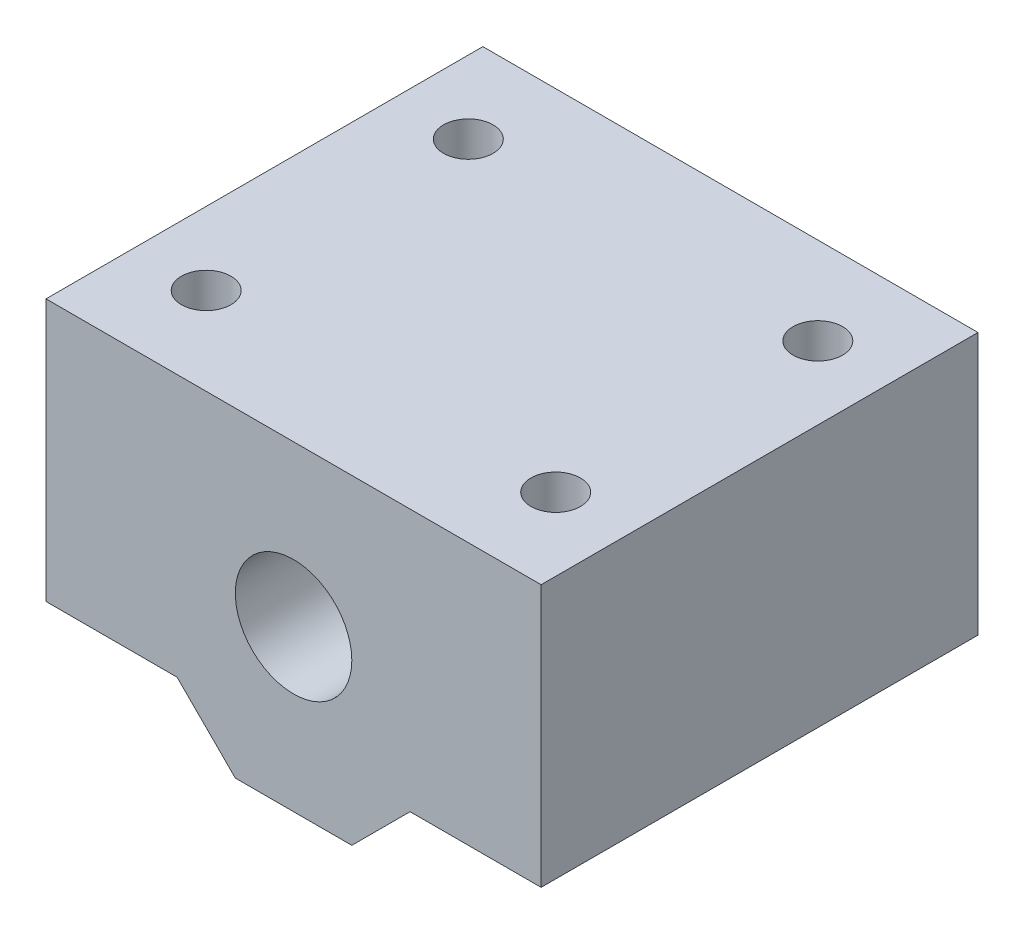
ISO-10303-21;
HEADER;
FILE_DESCRIPTION(('STEP AP214'),'2;1');
FILE_NAME('part.step','',(''),(''),'','','');
FILE_SCHEMA(('AUTOMOTIVE_DESIGN { 1 0 10303 214 1 1 1 1 }'));
ENDSEC;
DATA;
#1=APPLICATION_CONTEXT('core data for automotive mechanical design processes');
#2=APPLICATION_PROTOCOL_DEFINITION('international standard','automotive_design',2000,#1);
#3=PRODUCT_CONTEXT('',#1,'mechanical');
#4=PRODUCT('Part','Part','',(#3));
#5=PRODUCT_RELATED_PRODUCT_CATEGORY('part','',(#4));
#6=PRODUCT_DEFINITION_FORMATION('','',#4);
#7=PRODUCT_DEFINITION_CONTEXT('part definition',#1,'design');
#8=PRODUCT_DEFINITION('design','',#6,#7);
#9=PRODUCT_DEFINITION_SHAPE('','',#8);
#10=(LENGTH_UNIT() NAMED_UNIT(*) SI_UNIT(.MILLI.,.METRE.));
#11=(NAMED_UNIT(*) PLANE_ANGLE_UNIT() SI_UNIT($,.RADIAN.));
#12=(NAMED_UNIT(*) SI_UNIT($,.STERADIAN.) SOLID_ANGLE_UNIT());
#13=UNCERTAINTY_MEASURE_WITH_UNIT(LENGTH_MEASURE(1.E-05),#10,'distance_accuracy_value','');
#14=(GEOMETRIC_REPRESENTATION_CONTEXT(3) GLOBAL_UNCERTAINTY_ASSIGNED_CONTEXT((#13)) GLOBAL_UNIT_ASSIGNED_CONTEXT((#10,
#11,#12)) REPRESENTATION_CONTEXT('',''));
#15=CARTESIAN_POINT('',(0.,0.,0.));
#16=DIRECTION('',(0.,0.,1.));
#17=DIRECTION('',(1.,0.,0.));
#18=AXIS2_PLACEMENT_3D('',#15,#16,#17);
#19=CARTESIAN_POINT('',(0.,0.,30.));
#20=DIRECTION('',(0.,0.,-1.));
#21=DIRECTION('',(-1.,0.,0.));
#22=AXIS2_PLACEMENT_3D('',#19,#20,#21);
#23=PLANE('',#22);
#24=DIRECTION('',(0.,1.,0.));
#25=VECTOR('',#24,1.);
#26=CARTESIAN_POINT('',(17.,-7.,30.));
#27=LINE('',#26,#25);
#28=CARTESIAN_POINT('',(17.,-7.,30.));
#29=VERTEX_POINT('',#28);
#30=CARTESIAN_POINT('',(17.,11.,30.));
#31=VERTEX_POINT('',#30);
#32=EDGE_CURVE('E146',#29,#31,#27,.T.);
#33=ORIENTED_EDGE('',*,*,#32,.T.);
#34=DIRECTION('',(-1.,0.,0.));
#35=VECTOR('',#34,1.);
#36=CARTESIAN_POINT('',(-17.,11.,30.));
#37=LINE('',#36,#35);
#38=CARTESIAN_POINT('',(-17.,11.,30.));
#39=VERTEX_POINT('',#38);
#40=EDGE_CURVE('E94',#31,#39,#37,.T.);
#41=ORIENTED_EDGE('',*,*,#40,.T.);
#42=DIRECTION('',(0.,-1.,0.));
#43=VECTOR('',#42,1.);
#44=CARTESIAN_POINT('',(-17.,-7.,30.));
#45=LINE('',#44,#43);
#46=CARTESIAN_POINT('',(-17.,-7.,30.));
#47=VERTEX_POINT('',#46);
#48=EDGE_CURVE('E161',#39,#47,#45,.T.);
#49=ORIENTED_EDGE('',*,*,#48,.T.);
#50=DIRECTION('',(1.,0.,0.));
#51=VECTOR('',#50,1.);
#52=CARTESIAN_POINT('',(-17.,-7.,30.));
#53=LINE('',#52,#51);
#54=CARTESIAN_POINT('',(-8.,-7.,30.));
#55=VERTEX_POINT('',#54);
#56=EDGE_CURVE('E174',#47,#55,#53,.T.);
#57=ORIENTED_EDGE('',*,*,#56,.T.);
#58=DIRECTION('',(0.707106781186548,-0.707106781186548,0.));
#59=VECTOR('',#58,1.);
#60=CARTESIAN_POINT('',(-8.,-7.,30.));
#61=LINE('',#60,#59);
#62=CARTESIAN_POINT('',(-4.,-11.,30.));
#63=VERTEX_POINT('',#62);
#64=EDGE_CURVE('E113',#55,#63,#61,.T.);
#65=ORIENTED_EDGE('',*,*,#64,.T.);
#66=DIRECTION('',(1.,0.,0.));
#67=VECTOR('',#66,1.);
#68=CARTESIAN_POINT('',(-4.,-11.,30.));
#69=LINE('',#68,#67);
#70=CARTESIAN_POINT('',(3.99999999999999,-11.,30.));
#71=VERTEX_POINT('',#70);
#72=EDGE_CURVE('E107',#63,#71,#69,.T.);
#73=ORIENTED_EDGE('',*,*,#72,.T.);
#74=DIRECTION('',(0.707106781186548,0.707106781186548,0.));
#75=VECTOR('',#74,1.);
#76=CARTESIAN_POINT('',(7.99999999999999,-7.,30.));
#77=LINE('',#76,#75);
#78=CARTESIAN_POINT('',(7.99999999999999,-7.,30.));
#79=VERTEX_POINT('',#78);
#80=EDGE_CURVE('E111',#71,#79,#77,.T.);
#81=ORIENTED_EDGE('',*,*,#80,.T.);
#82=DIRECTION('',(1.,0.,0.));
#83=VECTOR('',#82,1.);
#84=CARTESIAN_POINT('',(17.,-7.,30.));
#85=LINE('',#84,#83);
#86=EDGE_CURVE('E51',#79,#29,#85,.T.);
#87=ORIENTED_EDGE('',*,*,#86,.T.);
#88=EDGE_LOOP('',(#33,#41,#49,#57,#65,#73,#81,#87));
#89=FACE_BOUND('',#88,.T.);
#90=CARTESIAN_POINT('',(0.,0.,30.));
#91=DIRECTION('',(0.,0.,1.));
#92=DIRECTION('',(1.,0.,0.));
#93=AXIS2_PLACEMENT_3D('',#90,#91,#92);
#94=CIRCLE('',#93,4.);
#95=CARTESIAN_POINT('',(3.99999999999999,0.,30.));
#96=VERTEX_POINT('',#95);
#97=EDGE_CURVE('E135',#96,#96,#94,.T.);
#98=ORIENTED_EDGE('',*,*,#97,.F.);
#99=EDGE_LOOP('',(#98));
#100=FACE_BOUND('',#99,.T.);
#101=ADVANCED_FACE('F34',(#89,#100),#23,.F.);
#102=CARTESIAN_POINT('',(0.,0.,0.));
#103=DIRECTION('',(0.,0.,-1.));
#104=DIRECTION('',(-1.,0.,0.));
#105=AXIS2_PLACEMENT_3D('',#102,#103,#104);
#106=PLANE('',#105);
#107=DIRECTION('',(0.,1.,0.));
#108=VECTOR('',#107,1.);
#109=CARTESIAN_POINT('',(17.,-7.,0.));
#110=LINE('',#109,#108);
#111=CARTESIAN_POINT('',(17.,-7.,0.));
#112=VERTEX_POINT('',#111);
#113=CARTESIAN_POINT('',(17.,11.,0.));
#114=VERTEX_POINT('',#113);
#115=EDGE_CURVE('E131',#112,#114,#110,.T.);
#116=ORIENTED_EDGE('',*,*,#115,.F.);
#117=DIRECTION('',(1.,0.,0.));
#118=VECTOR('',#117,1.);
#119=CARTESIAN_POINT('',(17.,-7.,0.));
#120=LINE('',#119,#118);
#121=CARTESIAN_POINT('',(7.99999999999999,-7.,0.));
#122=VERTEX_POINT('',#121);
#123=EDGE_CURVE('E86',#122,#112,#120,.T.);
#124=ORIENTED_EDGE('',*,*,#123,.F.);
#125=DIRECTION('',(0.707106781186548,0.707106781186548,0.));
#126=VECTOR('',#125,1.);
#127=CARTESIAN_POINT('',(7.99999999999999,-7.,0.));
#128=LINE('',#127,#126);
#129=CARTESIAN_POINT('',(3.99999999999999,-11.,0.));
#130=VERTEX_POINT('',#129);
#131=EDGE_CURVE('E80',#130,#122,#128,.T.);
#132=ORIENTED_EDGE('',*,*,#131,.F.);
#133=DIRECTION('',(1.,0.,0.));
#134=VECTOR('',#133,1.);
#135=CARTESIAN_POINT('',(-4.,-11.,0.));
#136=LINE('',#135,#134);
#137=CARTESIAN_POINT('',(-4.,-11.,0.));
#138=VERTEX_POINT('',#137);
#139=EDGE_CURVE('E121',#138,#130,#136,.T.);
#140=ORIENTED_EDGE('',*,*,#139,.F.);
#141=DIRECTION('',(0.707106781186548,-0.707106781186548,0.));
#142=VECTOR('',#141,1.);
#143=CARTESIAN_POINT('',(-8.,-7.,0.));
#144=LINE('',#143,#142);
#145=CARTESIAN_POINT('',(-8.,-7.,0.));
#146=VERTEX_POINT('',#145);
#147=EDGE_CURVE('E141',#146,#138,#144,.T.);
#148=ORIENTED_EDGE('',*,*,#147,.F.);
#149=DIRECTION('',(1.,0.,0.));
#150=VECTOR('',#149,1.);
#151=CARTESIAN_POINT('',(-17.,-7.,0.));
#152=LINE('',#151,#150);
#153=CARTESIAN_POINT('',(-17.,-7.,0.));
#154=VERTEX_POINT('',#153);
#155=EDGE_CURVE('E139',#154,#146,#152,.T.);
#156=ORIENTED_EDGE('',*,*,#155,.F.);
#157=DIRECTION('',(0.,-1.,0.));
#158=VECTOR('',#157,1.);
#159=CARTESIAN_POINT('',(-17.,-7.,0.));
#160=LINE('',#159,#158);
#161=CARTESIAN_POINT('',(-17.,11.,0.));
#162=VERTEX_POINT('',#161);
#163=EDGE_CURVE('E137',#162,#154,#160,.T.);
#164=ORIENTED_EDGE('',*,*,#163,.F.);
#165=DIRECTION('',(-1.,0.,0.));
#166=VECTOR('',#165,1.);
#167=CARTESIAN_POINT('',(-17.,11.,0.));
#168=LINE('',#167,#166);
#169=EDGE_CURVE('E134',#114,#162,#168,.T.);
#170=ORIENTED_EDGE('',*,*,#169,.F.);
#171=EDGE_LOOP('',(#116,#124,#132,#140,#148,#156,#164,#170));
#172=FACE_BOUND('',#171,.T.);
#173=CARTESIAN_POINT('',(0.,0.,0.));
#174=DIRECTION('',(0.,0.,1.));
#175=DIRECTION('',(1.,0.,0.));
#176=AXIS2_PLACEMENT_3D('',#173,#174,#175);
#177=CIRCLE('',#176,4.);
#178=CARTESIAN_POINT('',(3.99999999999999,0.,0.));
#179=VERTEX_POINT('',#178);
#180=EDGE_CURVE('E180',#179,#179,#177,.T.);
#181=ORIENTED_EDGE('',*,*,#180,.T.);
#182=EDGE_LOOP('',(#181));
#183=FACE_BOUND('',#182,.T.);
#184=ADVANCED_FACE('F165',(#172,#183),#106,.T.);
#185=CARTESIAN_POINT('',(17.,-7.,30.));
#186=DIRECTION('',(-1.,0.,0.));
#187=DIRECTION('',(0.,0.,1.));
#188=AXIS2_PLACEMENT_3D('',#185,#186,#187);
#189=PLANE('',#188);
#190=ORIENTED_EDGE('',*,*,#115,.T.);
#191=DIRECTION('',(0.,0.,-1.));
#192=VECTOR('',#191,1.);
#193=CARTESIAN_POINT('',(17.,11.,30.));
#194=LINE('',#193,#192);
#195=EDGE_CURVE('E11',#31,#114,#194,.T.);
#196=ORIENTED_EDGE('',*,*,#195,.F.);
#197=ORIENTED_EDGE('',*,*,#32,.F.);
#198=DIRECTION('',(0.,0.,-1.));
#199=VECTOR('',#198,1.);
#200=CARTESIAN_POINT('',(17.,-7.,30.));
#201=LINE('',#200,#199);
#202=EDGE_CURVE('E127',#29,#112,#201,.T.);
#203=ORIENTED_EDGE('',*,*,#202,.T.);
#204=EDGE_LOOP('',(#190,#196,#197,#203));
#205=FACE_BOUND('',#204,.T.);
#206=ADVANCED_FACE('F36',(#205),#189,.F.);
#207=CARTESIAN_POINT('',(-17.,11.,30.));
#208=DIRECTION('',(0.,-1.,0.));
#209=DIRECTION('',(0.,0.,-1.));
#210=AXIS2_PLACEMENT_3D('',#207,#208,#209);
#211=PLANE('',#210);
#212=CARTESIAN_POINT('',(12.,11.,6.));
#213=DIRECTION('',(0.,-1.,0.));
#214=DIRECTION('',(0.,0.,-1.));
#215=AXIS2_PLACEMENT_3D('',#212,#213,#214);
#216=CIRCLE('',#215,1.7);
#217=CARTESIAN_POINT('',(12.,11.,4.3));
#218=VERTEX_POINT('',#217);
#219=EDGE_CURVE('E203',#218,#218,#216,.T.);
#220=ORIENTED_EDGE('',*,*,#219,.T.);
#221=EDGE_LOOP('',(#220));
#222=FACE_BOUND('',#221,.T.);
#223=CARTESIAN_POINT('',(12.,11.,24.));
#224=DIRECTION('',(0.,-1.,0.));
#225=DIRECTION('',(0.,0.,-1.));
#226=AXIS2_PLACEMENT_3D('',#223,#224,#225);
#227=CIRCLE('',#226,1.7);
#228=CARTESIAN_POINT('',(12.,11.,22.3));
#229=VERTEX_POINT('',#228);
#230=EDGE_CURVE('E197',#229,#229,#227,.T.);
#231=ORIENTED_EDGE('',*,*,#230,.T.);
#232=EDGE_LOOP('',(#231));
#233=FACE_BOUND('',#232,.T.);
#234=CARTESIAN_POINT('',(-12.,11.,6.));
#235=DIRECTION('',(0.,-1.,0.));
#236=DIRECTION('',(0.,0.,-1.));
#237=AXIS2_PLACEMENT_3D('',#234,#235,#236);
#238=CIRCLE('',#237,1.7);
#239=CARTESIAN_POINT('',(-12.,11.,4.3));
#240=VERTEX_POINT('',#239);
#241=EDGE_CURVE('E191',#240,#240,#238,.T.);
#242=ORIENTED_EDGE('',*,*,#241,.T.);
#243=EDGE_LOOP('',(#242));
#244=FACE_BOUND('',#243,.T.);
#245=CARTESIAN_POINT('',(-12.,11.,24.));
#246=DIRECTION('',(0.,-1.,0.));
#247=DIRECTION('',(0.,0.,-1.));
#248=AXIS2_PLACEMENT_3D('',#245,#246,#247);
#249=CIRCLE('',#248,1.7);
#250=CARTESIAN_POINT('',(-12.,11.,22.3));
#251=VERTEX_POINT('',#250);
#252=EDGE_CURVE('E183',#251,#251,#249,.T.);
#253=ORIENTED_EDGE('',*,*,#252,.T.);
#254=EDGE_LOOP('',(#253));
#255=FACE_BOUND('',#254,.T.);
#256=ORIENTED_EDGE('',*,*,#169,.T.);
#257=DIRECTION('',(0.,0.,-1.));
#258=VECTOR('',#257,1.);
#259=CARTESIAN_POINT('',(-17.,11.,30.));
#260=LINE('',#259,#258);
#261=EDGE_CURVE('E43',#39,#162,#260,.T.);
#262=ORIENTED_EDGE('',*,*,#261,.F.);
#263=ORIENTED_EDGE('',*,*,#40,.F.);
#264=ORIENTED_EDGE('',*,*,#195,.T.);
#265=EDGE_LOOP('',(#256,#262,#263,#264));
#266=FACE_BOUND('',#265,.T.);
#267=ADVANCED_FACE('F227',(#222,#233,#244,#255,#266),#211,.F.);
#268=CARTESIAN_POINT('',(-17.,-7.,30.));
#269=DIRECTION('',(1.,0.,0.));
#270=DIRECTION('',(0.,0.,-1.));
#271=AXIS2_PLACEMENT_3D('',#268,#269,#270);
#272=PLANE('',#271);
#273=ORIENTED_EDGE('',*,*,#163,.T.);
#274=DIRECTION('',(0.,0.,-1.));
#275=VECTOR('',#274,1.);
#276=CARTESIAN_POINT('',(-17.,-7.,30.));
#277=LINE('',#276,#275);
#278=EDGE_CURVE('E153',#47,#154,#277,.T.);
#279=ORIENTED_EDGE('',*,*,#278,.F.);
#280=ORIENTED_EDGE('',*,*,#48,.F.);
#281=ORIENTED_EDGE('',*,*,#261,.T.);
#282=EDGE_LOOP('',(#273,#279,#280,#281));
#283=FACE_BOUND('',#282,.T.);
#284=ADVANCED_FACE('F159',(#283),#272,.F.);
#285=CARTESIAN_POINT('',(-17.,-7.,30.));
#286=DIRECTION('',(0.,1.,0.));
#287=DIRECTION('',(0.,0.,1.));
#288=AXIS2_PLACEMENT_3D('',#285,#286,#287);
#289=PLANE('',#288);
#290=CARTESIAN_POINT('',(-12.,-7.,6.));
#291=DIRECTION('',(0.,-1.,0.));
#292=DIRECTION('',(0.,0.,-1.));
#293=AXIS2_PLACEMENT_3D('',#290,#291,#292);
#294=CIRCLE('',#293,1.7);
#295=CARTESIAN_POINT('',(-12.,-7.,4.3));
#296=VERTEX_POINT('',#295);
#297=EDGE_CURVE('E194',#296,#296,#294,.T.);
#298=ORIENTED_EDGE('',*,*,#297,.F.);
#299=EDGE_LOOP('',(#298));
#300=FACE_BOUND('',#299,.T.);
#301=CARTESIAN_POINT('',(-12.,-7.,24.));
#302=DIRECTION('',(0.,-1.,0.));
#303=DIRECTION('',(0.,0.,-1.));
#304=AXIS2_PLACEMENT_3D('',#301,#302,#303);
#305=CIRCLE('',#304,1.7);
#306=CARTESIAN_POINT('',(-12.,-7.,22.3));
#307=VERTEX_POINT('',#306);
#308=EDGE_CURVE('E188',#307,#307,#305,.T.);
#309=ORIENTED_EDGE('',*,*,#308,.F.);
#310=EDGE_LOOP('',(#309));
#311=FACE_BOUND('',#310,.T.);
#312=ORIENTED_EDGE('',*,*,#155,.T.);
#313=DIRECTION('',(0.,0.,-1.));
#314=VECTOR('',#313,1.);
#315=CARTESIAN_POINT('',(-8.,-7.,30.));
#316=LINE('',#315,#314);
#317=EDGE_CURVE('E150',#55,#146,#316,.T.);
#318=ORIENTED_EDGE('',*,*,#317,.F.);
#319=ORIENTED_EDGE('',*,*,#56,.F.);
#320=ORIENTED_EDGE('',*,*,#278,.T.);
#321=EDGE_LOOP('',(#312,#318,#319,#320));
#322=FACE_BOUND('',#321,.T.);
#323=ADVANCED_FACE('F170',(#300,#311,#322),#289,.F.);
#324=CARTESIAN_POINT('',(-8.,-7.,30.));
#325=DIRECTION('',(0.707106781186548,0.707106781186547,0.));
#326=DIRECTION('',(-0.707106781186547,0.707106781186548,0.));
#327=AXIS2_PLACEMENT_3D('',#324,#325,#326);
#328=PLANE('',#327);
#329=ORIENTED_EDGE('',*,*,#147,.T.);
#330=DIRECTION('',(0.,0.,-1.));
#331=VECTOR('',#330,1.);
#332=CARTESIAN_POINT('',(-4.,-11.,30.));
#333=LINE('',#332,#331);
#334=EDGE_CURVE('E122',#63,#138,#333,.T.);
#335=ORIENTED_EDGE('',*,*,#334,.F.);
#336=ORIENTED_EDGE('',*,*,#64,.F.);
#337=ORIENTED_EDGE('',*,*,#317,.T.);
#338=EDGE_LOOP('',(#329,#335,#336,#337));
#339=FACE_BOUND('',#338,.T.);
#340=ADVANCED_FACE('F173',(#339),#328,.F.);
#341=CARTESIAN_POINT('',(-4.,-11.,30.));
#342=DIRECTION('',(0.,1.,0.));
#343=DIRECTION('',(0.,0.,1.));
#344=AXIS2_PLACEMENT_3D('',#341,#342,#343);
#345=PLANE('',#344);
#346=ORIENTED_EDGE('',*,*,#139,.T.);
#347=DIRECTION('',(0.,0.,-1.));
#348=VECTOR('',#347,1.);
#349=CARTESIAN_POINT('',(3.99999999999999,-11.,30.));
#350=LINE('',#349,#348);
#351=EDGE_CURVE('E118',#71,#130,#350,.T.);
#352=ORIENTED_EDGE('',*,*,#351,.F.);
#353=ORIENTED_EDGE('',*,*,#72,.F.);
#354=ORIENTED_EDGE('',*,*,#334,.T.);
#355=EDGE_LOOP('',(#346,#352,#353,#354));
#356=FACE_BOUND('',#355,.T.);
#357=ADVANCED_FACE('F119',(#356),#345,.F.);
#358=CARTESIAN_POINT('',(7.99999999999999,-7.,30.));
#359=DIRECTION('',(-0.707106781186548,0.707106781186547,0.));
#360=DIRECTION('',(-0.707106781186547,-0.707106781186548,0.));
#361=AXIS2_PLACEMENT_3D('',#358,#359,#360);
#362=PLANE('',#361);
#363=ORIENTED_EDGE('',*,*,#131,.T.);
#364=DIRECTION('',(0.,0.,-1.));
#365=VECTOR('',#364,1.);
#366=CARTESIAN_POINT('',(7.99999999999999,-7.,30.));
#367=LINE('',#366,#365);
#368=EDGE_CURVE('E123',#79,#122,#367,.T.);
#369=ORIENTED_EDGE('',*,*,#368,.F.);
#370=ORIENTED_EDGE('',*,*,#80,.F.);
#371=ORIENTED_EDGE('',*,*,#351,.T.);
#372=EDGE_LOOP('',(#363,#369,#370,#371));
#373=FACE_BOUND('',#372,.T.);
#374=ADVANCED_FACE('F125',(#373),#362,.F.);
#375=CARTESIAN_POINT('',(17.,-7.,30.));
#376=DIRECTION('',(0.,1.,0.));
#377=DIRECTION('',(0.,0.,1.));
#378=AXIS2_PLACEMENT_3D('',#375,#376,#377);
#379=PLANE('',#378);
#380=CARTESIAN_POINT('',(12.,-7.,6.));
#381=DIRECTION('',(0.,-1.,0.));
#382=DIRECTION('',(0.,0.,-1.));
#383=AXIS2_PLACEMENT_3D('',#380,#381,#382);
#384=CIRCLE('',#383,1.7);
#385=CARTESIAN_POINT('',(12.,-7.,4.3));
#386=VERTEX_POINT('',#385);
#387=EDGE_CURVE('E206',#386,#386,#384,.T.);
#388=ORIENTED_EDGE('',*,*,#387,.F.);
#389=EDGE_LOOP('',(#388));
#390=FACE_BOUND('',#389,.T.);
#391=CARTESIAN_POINT('',(12.,-7.,24.));
#392=DIRECTION('',(0.,-1.,0.));
#393=DIRECTION('',(0.,0.,-1.));
#394=AXIS2_PLACEMENT_3D('',#391,#392,#393);
#395=CIRCLE('',#394,1.7);
#396=CARTESIAN_POINT('',(12.,-7.,22.3));
#397=VERTEX_POINT('',#396);
#398=EDGE_CURVE('E200',#397,#397,#395,.T.);
#399=ORIENTED_EDGE('',*,*,#398,.F.);
#400=EDGE_LOOP('',(#399));
#401=FACE_BOUND('',#400,.T.);
#402=ORIENTED_EDGE('',*,*,#123,.T.);
#403=ORIENTED_EDGE('',*,*,#202,.F.);
#404=ORIENTED_EDGE('',*,*,#86,.F.);
#405=ORIENTED_EDGE('',*,*,#368,.T.);
#406=EDGE_LOOP('',(#402,#403,#404,#405));
#407=FACE_BOUND('',#406,.T.);
#408=ADVANCED_FACE('F213',(#390,#401,#407),#379,.F.);
#409=CARTESIAN_POINT('',(0.,0.,30.));
#410=DIRECTION('',(0.,0.,-1.));
#411=DIRECTION('',(-1.,0.,0.));
#412=AXIS2_PLACEMENT_3D('',#409,#410,#411);
#413=CYLINDRICAL_SURFACE('',#412,4.);
#414=ORIENTED_EDGE('',*,*,#97,.T.);
#415=EDGE_LOOP('',(#414));
#416=FACE_BOUND('',#415,.T.);
#417=ORIENTED_EDGE('',*,*,#180,.F.);
#418=EDGE_LOOP('',(#417));
#419=FACE_BOUND('',#418,.T.);
#420=ADVANCED_FACE('F216',(#416,#419),#413,.F.);
#421=CARTESIAN_POINT('',(-12.,13.,24.));
#422=DIRECTION('',(0.,-1.,0.));
#423=DIRECTION('',(0.,0.,-1.));
#424=AXIS2_PLACEMENT_3D('',#421,#422,#423);
#425=CYLINDRICAL_SURFACE('',#424,1.7);
#426=ORIENTED_EDGE('',*,*,#308,.T.);
#427=EDGE_LOOP('',(#426));
#428=FACE_BOUND('',#427,.T.);
#429=ORIENTED_EDGE('',*,*,#252,.F.);
#430=EDGE_LOOP('',(#429));
#431=FACE_BOUND('',#430,.T.);
#432=ADVANCED_FACE('F290',(#428,#431),#425,.F.);
#433=CARTESIAN_POINT('',(-12.,13.,6.));
#434=DIRECTION('',(0.,-1.,0.));
#435=DIRECTION('',(0.,0.,-1.));
#436=AXIS2_PLACEMENT_3D('',#433,#434,#435);
#437=CYLINDRICAL_SURFACE('',#436,1.7);
#438=ORIENTED_EDGE('',*,*,#297,.T.);
#439=EDGE_LOOP('',(#438));
#440=FACE_BOUND('',#439,.T.);
#441=ORIENTED_EDGE('',*,*,#241,.F.);
#442=EDGE_LOOP('',(#441));
#443=FACE_BOUND('',#442,.T.);
#444=ADVANCED_FACE('F223',(#440,#443),#437,.F.);
#445=CARTESIAN_POINT('',(12.,13.,24.));
#446=DIRECTION('',(0.,-1.,0.));
#447=DIRECTION('',(0.,0.,-1.));
#448=AXIS2_PLACEMENT_3D('',#445,#446,#447);
#449=CYLINDRICAL_SURFACE('',#448,1.7);
#450=ORIENTED_EDGE('',*,*,#398,.T.);
#451=EDGE_LOOP('',(#450));
#452=FACE_BOUND('',#451,.T.);
#453=ORIENTED_EDGE('',*,*,#230,.F.);
#454=EDGE_LOOP('',(#453));
#455=FACE_BOUND('',#454,.T.);
#456=ADVANCED_FACE('F220',(#452,#455),#449,.F.);
#457=CARTESIAN_POINT('',(12.,13.,6.));
#458=DIRECTION('',(0.,-1.,0.));
#459=DIRECTION('',(0.,0.,-1.));
#460=AXIS2_PLACEMENT_3D('',#457,#458,#459);
#461=CYLINDRICAL_SURFACE('',#460,1.7);
#462=ORIENTED_EDGE('',*,*,#387,.T.);
#463=EDGE_LOOP('',(#462));
#464=FACE_BOUND('',#463,.T.);
#465=ORIENTED_EDGE('',*,*,#219,.F.);
#466=EDGE_LOOP('',(#465));
#467=FACE_BOUND('',#466,.T.);
#468=ADVANCED_FACE('F210',(#464,#467),#461,.F.);
#469=CLOSED_SHELL('',(#101,#184,#206,#267,#284,#323,#340,#357,#374,#408,#420,#432,#444,#456,#468));
#470=MANIFOLD_SOLID_BREP('B2',#469);
#471=ADVANCED_BREP_SHAPE_REPRESENTATION('',(#18,#470),#14);
#472=SHAPE_DEFINITION_REPRESENTATION(#9,#471);
ENDSEC;
END-ISO-10303-21;
